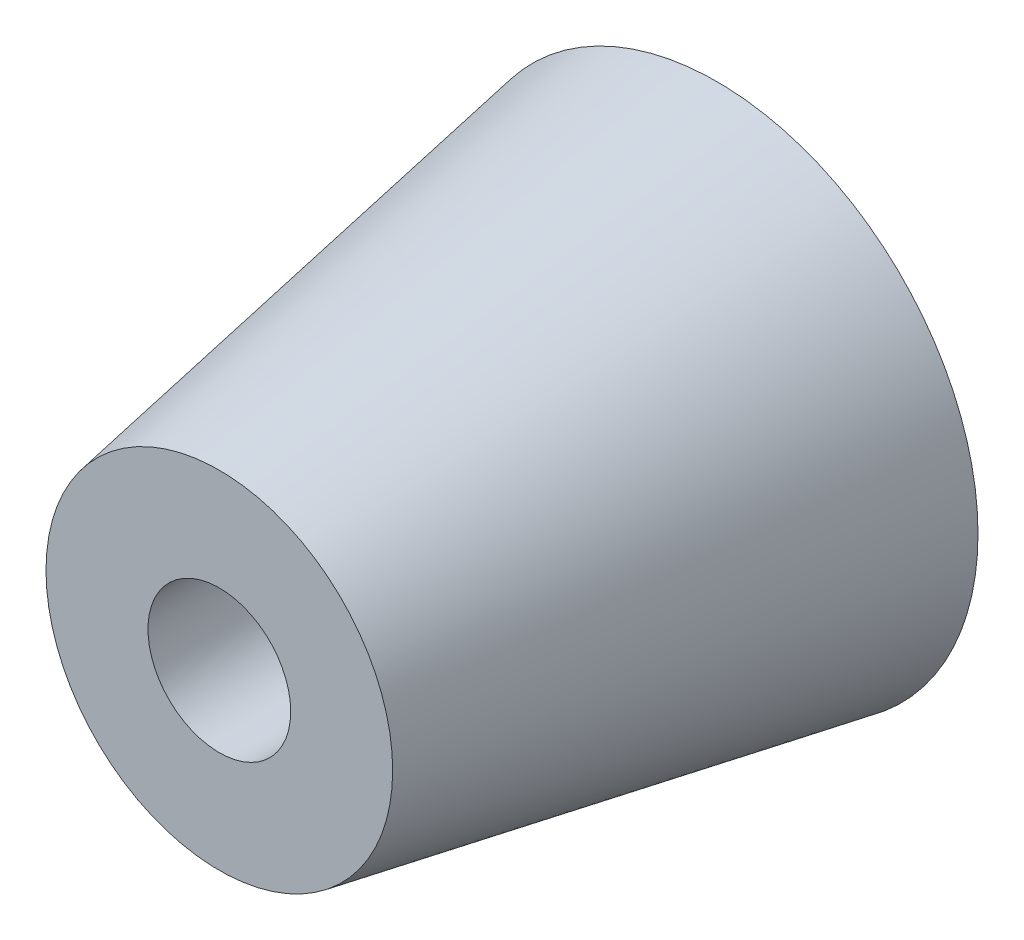
ISO-10303-21;
HEADER;
FILE_DESCRIPTION(('STEP AP214'),'2;1');
FILE_NAME('part.step','',(''),(''),'','','');
FILE_SCHEMA(('AUTOMOTIVE_DESIGN { 1 0 10303 214 1 1 1 1 }'));
ENDSEC;
DATA;
#1=APPLICATION_CONTEXT('core data for automotive mechanical design processes');
#2=APPLICATION_PROTOCOL_DEFINITION('international standard','automotive_design',2000,#1);
#3=PRODUCT_CONTEXT('',#1,'mechanical');
#4=PRODUCT('Part','Part','',(#3));
#5=PRODUCT_RELATED_PRODUCT_CATEGORY('part','',(#4));
#6=PRODUCT_DEFINITION_FORMATION('','',#4);
#7=PRODUCT_DEFINITION_CONTEXT('part definition',#1,'design');
#8=PRODUCT_DEFINITION('design','',#6,#7);
#9=PRODUCT_DEFINITION_SHAPE('','',#8);
#10=(LENGTH_UNIT() NAMED_UNIT(*) SI_UNIT(.MILLI.,.METRE.));
#11=(NAMED_UNIT(*) PLANE_ANGLE_UNIT() SI_UNIT($,.RADIAN.));
#12=(NAMED_UNIT(*) SI_UNIT($,.STERADIAN.) SOLID_ANGLE_UNIT());
#13=UNCERTAINTY_MEASURE_WITH_UNIT(LENGTH_MEASURE(1.E-05),#10,'distance_accuracy_value','');
#14=(GEOMETRIC_REPRESENTATION_CONTEXT(3) GLOBAL_UNCERTAINTY_ASSIGNED_CONTEXT((#13)) GLOBAL_UNIT_ASSIGNED_CONTEXT((#10,
#11,#12)) REPRESENTATION_CONTEXT('',''));
#15=CARTESIAN_POINT('',(0.,0.,0.));
#16=DIRECTION('',(0.,0.,1.));
#17=DIRECTION('',(1.,0.,0.));
#18=AXIS2_PLACEMENT_3D('',#15,#16,#17);
#19=CARTESIAN_POINT('',(0.,8.5,33.7153604632454));
#20=DIRECTION('',(0.,0.,-1.));
#21=DIRECTION('',(-1.,0.,0.));
#22=AXIS2_PLACEMENT_3D('',#19,#20,#21);
#23=PLANE('',#22);
#24=CARTESIAN_POINT('',(0.,0.,33.7153604632454));
#25=DIRECTION('',(0.,0.,1.));
#26=DIRECTION('',(1.,0.,0.));
#27=AXIS2_PLACEMENT_3D('',#24,#25,#26);
#28=CIRCLE('',#27,3.5);
#29=CARTESIAN_POINT('',(3.5,0.,33.7153604632454));
#30=VERTEX_POINT('',#29);
#31=EDGE_CURVE('E10',#30,#30,#28,.T.);
#32=ORIENTED_EDGE('',*,*,#31,.F.);
#33=EDGE_LOOP('',(#32));
#34=FACE_BOUND('',#33,.T.);
#35=CARTESIAN_POINT('',(0.,0.,33.7153604632454));
#36=DIRECTION('',(0.,0.,1.));
#37=DIRECTION('',(1.,0.,0.));
#38=AXIS2_PLACEMENT_3D('',#35,#36,#37);
#39=CIRCLE('',#38,8.5);
#40=CARTESIAN_POINT('',(8.5,0.,33.7153604632454));
#41=VERTEX_POINT('',#40);
#42=EDGE_CURVE('E50',#41,#41,#39,.T.);
#43=ORIENTED_EDGE('',*,*,#42,.T.);
#44=EDGE_LOOP('',(#43));
#45=FACE_BOUND('',#44,.T.);
#46=ADVANCED_FACE('F31',(#34,#45),#23,.F.);
#47=CARTESIAN_POINT('',(0.,0.,51.4954979569622));
#48=DIRECTION('',(0.,0.,1.));
#49=DIRECTION('',(1.,0.,0.));
#50=AXIS2_PLACEMENT_3D('',#47,#48,#49);
#51=CYLINDRICAL_SURFACE('',#50,3.5);
#52=CARTESIAN_POINT('',(0.,0.,28.7153604632454));
#53=DIRECTION('',(0.,0.,1.));
#54=DIRECTION('',(1.,0.,0.));
#55=AXIS2_PLACEMENT_3D('',#52,#53,#54);
#56=CIRCLE('',#55,3.5);
#57=CARTESIAN_POINT('',(3.5,0.,28.7153604632454));
#58=VERTEX_POINT('',#57);
#59=EDGE_CURVE('E37',#58,#58,#56,.T.);
#60=ORIENTED_EDGE('',*,*,#59,.F.);
#61=EDGE_LOOP('',(#60));
#62=FACE_BOUND('',#61,.T.);
#63=ORIENTED_EDGE('',*,*,#31,.T.);
#64=EDGE_LOOP('',(#63));
#65=FACE_BOUND('',#64,.T.);
#66=ADVANCED_FACE('F69',(#62,#65),#51,.F.);
#67=CARTESIAN_POINT('',(0.,0.,28.7153604632454));
#68=DIRECTION('',(0.,0.,-1.));
#69=DIRECTION('',(-1.,0.,0.));
#70=AXIS2_PLACEMENT_3D('',#67,#68,#69);
#71=CONICAL_SURFACE('',#70,3.5,0.191346121498645);
#72=CARTESIAN_POINT('',(0.,0.,9.31536046324542));
#73=DIRECTION('',(0.,0.,1.));
#74=DIRECTION('',(1.,0.,0.));
#75=AXIS2_PLACEMENT_3D('',#72,#73,#74);
#76=CIRCLE('',#75,7.25809253905928);
#77=CARTESIAN_POINT('',(7.25809253905928,0.,9.31536046324542));
#78=VERTEX_POINT('',#77);
#79=EDGE_CURVE('E41',#78,#78,#76,.T.);
#80=ORIENTED_EDGE('',*,*,#79,.F.);
#81=EDGE_LOOP('',(#80));
#82=FACE_BOUND('',#81,.T.);
#83=ORIENTED_EDGE('',*,*,#59,.T.);
#84=EDGE_LOOP('',(#83));
#85=FACE_BOUND('',#84,.T.);
#86=ADVANCED_FACE('F64',(#82,#85),#71,.F.);
#87=CARTESIAN_POINT('',(0.,12.8023783292866,9.31536046324542));
#88=DIRECTION('',(0.,0.,1.));
#89=DIRECTION('',(1.,0.,0.));
#90=AXIS2_PLACEMENT_3D('',#87,#88,#89);
#91=PLANE('',#90);
#92=CARTESIAN_POINT('',(0.,0.,9.31536046324542));
#93=DIRECTION('',(0.,0.,1.));
#94=DIRECTION('',(1.,0.,0.));
#95=AXIS2_PLACEMENT_3D('',#92,#93,#94);
#96=CIRCLE('',#95,12.8023783292866);
#97=CARTESIAN_POINT('',(12.8023783292866,0.,9.31536046324542));
#98=VERTEX_POINT('',#97);
#99=EDGE_CURVE('E45',#98,#98,#96,.T.);
#100=ORIENTED_EDGE('',*,*,#99,.F.);
#101=EDGE_LOOP('',(#100));
#102=FACE_BOUND('',#101,.T.);
#103=ORIENTED_EDGE('',*,*,#79,.T.);
#104=EDGE_LOOP('',(#103));
#105=FACE_BOUND('',#104,.T.);
#106=ADVANCED_FACE('F58',(#102,#105),#91,.F.);
#107=CARTESIAN_POINT('',(0.,0.,9.31536046324542));
#108=DIRECTION('',(0.,0.,-1.));
#109=DIRECTION('',(-1.,0.,0.));
#110=AXIS2_PLACEMENT_3D('',#107,#108,#109);
#111=CONICAL_SURFACE('',#110,12.8023783292866,0.174532925199434);
#112=ORIENTED_EDGE('',*,*,#42,.F.);
#113=EDGE_LOOP('',(#112));
#114=FACE_BOUND('',#113,.T.);
#115=ORIENTED_EDGE('',*,*,#99,.T.);
#116=EDGE_LOOP('',(#115));
#117=FACE_BOUND('',#116,.T.);
#118=ADVANCED_FACE('F55',(#114,#117),#111,.T.);
#119=CLOSED_SHELL('',(#46,#66,#86,#106,#118));
#120=MANIFOLD_SOLID_BREP('B2',#119);
#121=ADVANCED_BREP_SHAPE_REPRESENTATION('',(#18,#120),#14);
#122=SHAPE_DEFINITION_REPRESENTATION(#9,#121);
ENDSEC;
END-ISO-10303-21;
